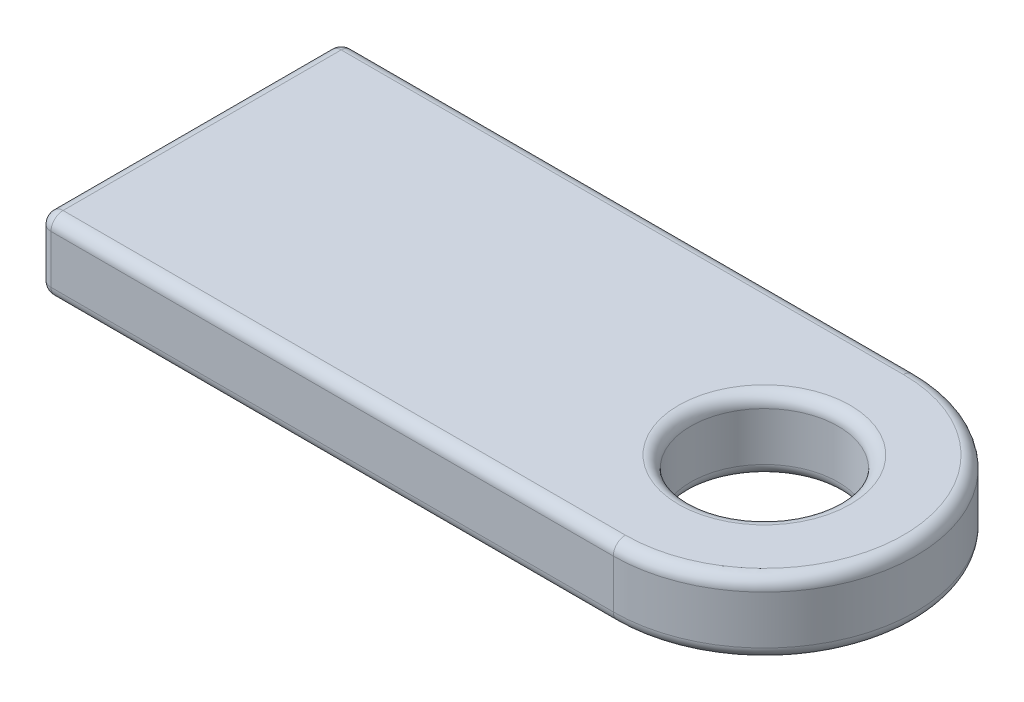
ISO-10303-21;
HEADER;
FILE_DESCRIPTION(('STEP AP214'),'2;1');
FILE_NAME('part.step','',(''),(''),'','','');
FILE_SCHEMA(('AUTOMOTIVE_DESIGN { 1 0 10303 214 1 1 1 1 }'));
ENDSEC;
DATA;
#1=APPLICATION_CONTEXT('core data for automotive mechanical design processes');
#2=APPLICATION_PROTOCOL_DEFINITION('international standard','automotive_design',2000,#1);
#3=PRODUCT_CONTEXT('',#1,'mechanical');
#4=PRODUCT('Part','Part','',(#3));
#5=PRODUCT_RELATED_PRODUCT_CATEGORY('part','',(#4));
#6=PRODUCT_DEFINITION_FORMATION('','',#4);
#7=PRODUCT_DEFINITION_CONTEXT('part definition',#1,'design');
#8=PRODUCT_DEFINITION('design','',#6,#7);
#9=PRODUCT_DEFINITION_SHAPE('','',#8);
#10=(LENGTH_UNIT() NAMED_UNIT(*) SI_UNIT(.MILLI.,.METRE.));
#11=(NAMED_UNIT(*) PLANE_ANGLE_UNIT() SI_UNIT($,.RADIAN.));
#12=(NAMED_UNIT(*) SI_UNIT($,.STERADIAN.) SOLID_ANGLE_UNIT());
#13=UNCERTAINTY_MEASURE_WITH_UNIT(LENGTH_MEASURE(1.E-05),#10,'distance_accuracy_value','');
#14=(GEOMETRIC_REPRESENTATION_CONTEXT(3) GLOBAL_UNCERTAINTY_ASSIGNED_CONTEXT((#13)) GLOBAL_UNIT_ASSIGNED_CONTEXT((#10,
#11,#12)) REPRESENTATION_CONTEXT('',''));
#15=CARTESIAN_POINT('',(0.,0.,0.));
#16=DIRECTION('',(0.,0.,1.));
#17=DIRECTION('',(1.,0.,0.));
#18=AXIS2_PLACEMENT_3D('',#15,#16,#17);
#19=CARTESIAN_POINT('',(23.75,3.,-6.25));
#20=DIRECTION('',(0.,1.,0.));
#21=DIRECTION('',(0.,0.,1.));
#22=AXIS2_PLACEMENT_3D('',#19,#20,#21);
#23=PLANE('',#22);
#24=CARTESIAN_POINT('',(23.75,3.,-6.25));
#25=DIRECTION('',(0.,1.,0.));
#26=DIRECTION('',(0.,0.,1.));
#27=AXIS2_PLACEMENT_3D('',#24,#25,#26);
#28=CIRCLE('',#27,3.55);
#29=CARTESIAN_POINT('',(23.75,3.,-2.7));
#30=VERTEX_POINT('',#29);
#31=EDGE_CURVE('E11',#30,#30,#28,.F.);
#32=ORIENTED_EDGE('',*,*,#31,.T.);
#33=EDGE_LOOP('',(#32));
#34=FACE_BOUND('',#33,.T.);
#35=CARTESIAN_POINT('',(23.75,3.,-6.25));
#36=DIRECTION('',(0.,1.,0.));
#37=DIRECTION('',(0.,0.,1.));
#38=AXIS2_PLACEMENT_3D('',#35,#36,#37);
#39=CIRCLE('',#38,5.75);
#40=CARTESIAN_POINT('',(23.75,3.,-0.500000000000002));
#41=VERTEX_POINT('',#40);
#42=CARTESIAN_POINT('',(23.75,3.,-12.));
#43=VERTEX_POINT('',#42);
#44=EDGE_CURVE('E57',#41,#43,#39,.T.);
#45=ORIENTED_EDGE('',*,*,#44,.T.);
#46=DIRECTION('',(-1.,0.,0.));
#47=VECTOR('',#46,1.);
#48=CARTESIAN_POINT('',(0.,3.,-12.));
#49=LINE('',#48,#47);
#50=CARTESIAN_POINT('',(0.5,3.,-12.));
#51=VERTEX_POINT('',#50);
#52=EDGE_CURVE('E49',#43,#51,#49,.T.);
#53=ORIENTED_EDGE('',*,*,#52,.T.);
#54=DIRECTION('',(0.,0.,1.));
#55=VECTOR('',#54,1.);
#56=CARTESIAN_POINT('',(0.5,3.,0.));
#57=LINE('',#56,#55);
#58=CARTESIAN_POINT('',(0.5,3.,-0.5));
#59=VERTEX_POINT('',#58);
#60=EDGE_CURVE('E212',#51,#59,#57,.T.);
#61=ORIENTED_EDGE('',*,*,#60,.T.);
#62=DIRECTION('',(1.,0.,0.));
#63=VECTOR('',#62,1.);
#64=CARTESIAN_POINT('',(23.75,3.,-0.500000000000002));
#65=LINE('',#64,#63);
#66=EDGE_CURVE('E62',#59,#41,#65,.T.);
#67=ORIENTED_EDGE('',*,*,#66,.T.);
#68=EDGE_LOOP('',(#45,#53,#61,#67));
#69=FACE_BOUND('',#68,.T.);
#70=ADVANCED_FACE('F39',(#34,#69),#23,.T.);
#71=CARTESIAN_POINT('',(23.75,0.,-6.25));
#72=DIRECTION('',(0.,1.,0.));
#73=DIRECTION('',(0.,0.,1.));
#74=AXIS2_PLACEMENT_3D('',#71,#72,#73);
#75=PLANE('',#74);
#76=CARTESIAN_POINT('',(23.75,0.,-6.25));
#77=DIRECTION('',(0.,1.,0.));
#78=DIRECTION('',(0.,0.,1.));
#79=AXIS2_PLACEMENT_3D('',#76,#77,#78);
#80=CIRCLE('',#79,3.55);
#81=CARTESIAN_POINT('',(23.75,0.,-2.7));
#82=VERTEX_POINT('',#81);
#83=EDGE_CURVE('E159',#82,#82,#80,.T.);
#84=ORIENTED_EDGE('',*,*,#83,.T.);
#85=EDGE_LOOP('',(#84));
#86=FACE_BOUND('',#85,.T.);
#87=CARTESIAN_POINT('',(23.75,0.,-6.25));
#88=DIRECTION('',(0.,1.,0.));
#89=DIRECTION('',(0.,0.,1.));
#90=AXIS2_PLACEMENT_3D('',#87,#88,#89);
#91=CIRCLE('',#90,5.75);
#92=CARTESIAN_POINT('',(23.75,0.,-12.));
#93=VERTEX_POINT('',#92);
#94=CARTESIAN_POINT('',(23.75,0.,-0.500000000000002));
#95=VERTEX_POINT('',#94);
#96=EDGE_CURVE('E157',#93,#95,#91,.F.);
#97=ORIENTED_EDGE('',*,*,#96,.T.);
#98=DIRECTION('',(1.,0.,0.));
#99=VECTOR('',#98,1.);
#100=CARTESIAN_POINT('',(23.75,0.,-0.500000000000002));
#101=LINE('',#100,#99);
#102=CARTESIAN_POINT('',(0.5,0.,-0.5));
#103=VERTEX_POINT('',#102);
#104=EDGE_CURVE('E123',#95,#103,#101,.F.);
#105=ORIENTED_EDGE('',*,*,#104,.T.);
#106=DIRECTION('',(0.,0.,1.));
#107=VECTOR('',#106,1.);
#108=CARTESIAN_POINT('',(0.5,0.,-6.25));
#109=LINE('',#108,#107);
#110=CARTESIAN_POINT('',(0.5,0.,-12.));
#111=VERTEX_POINT('',#110);
#112=EDGE_CURVE('E145',#103,#111,#109,.F.);
#113=ORIENTED_EDGE('',*,*,#112,.T.);
#114=DIRECTION('',(-1.,0.,0.));
#115=VECTOR('',#114,1.);
#116=CARTESIAN_POINT('',(23.75,0.,-12.));
#117=LINE('',#116,#115);
#118=EDGE_CURVE('E152',#111,#93,#117,.F.);
#119=ORIENTED_EDGE('',*,*,#118,.T.);
#120=EDGE_LOOP('',(#97,#105,#113,#119));
#121=FACE_BOUND('',#120,.T.);
#122=ADVANCED_FACE('F155',(#86,#121),#75,.F.);
#123=CARTESIAN_POINT('',(0.,3.,0.));
#124=DIRECTION('',(1.,0.,0.));
#125=DIRECTION('',(0.,0.,-1.));
#126=AXIS2_PLACEMENT_3D('',#123,#124,#125);
#127=PLANE('',#126);
#128=DIRECTION('',(0.,0.,1.));
#129=VECTOR('',#128,1.);
#130=CARTESIAN_POINT('',(0.,0.5,0.));
#131=LINE('',#130,#129);
#132=CARTESIAN_POINT('',(0.,0.5,-12.));
#133=VERTEX_POINT('',#132);
#134=CARTESIAN_POINT('',(0.,0.5,-0.5));
#135=VERTEX_POINT('',#134);
#136=EDGE_CURVE('E205',#133,#135,#131,.T.);
#137=ORIENTED_EDGE('',*,*,#136,.T.);
#138=DIRECTION('',(0.,-1.,0.));
#139=VECTOR('',#138,1.);
#140=CARTESIAN_POINT('',(0.,3.,-0.5));
#141=LINE('',#140,#139);
#142=CARTESIAN_POINT('',(0.,2.5,-0.5));
#143=VERTEX_POINT('',#142);
#144=EDGE_CURVE('E209',#135,#143,#141,.F.);
#145=ORIENTED_EDGE('',*,*,#144,.T.);
#146=DIRECTION('',(0.,0.,1.));
#147=VECTOR('',#146,1.);
#148=CARTESIAN_POINT('',(0.,2.5,-12.5));
#149=LINE('',#148,#147);
#150=CARTESIAN_POINT('',(0.,2.5,-12.));
#151=VERTEX_POINT('',#150);
#152=EDGE_CURVE('E202',#143,#151,#149,.F.);
#153=ORIENTED_EDGE('',*,*,#152,.T.);
#154=DIRECTION('',(0.,-1.,0.));
#155=VECTOR('',#154,1.);
#156=CARTESIAN_POINT('',(0.,3.,-12.));
#157=LINE('',#156,#155);
#158=EDGE_CURVE('E199',#151,#133,#157,.T.);
#159=ORIENTED_EDGE('',*,*,#158,.T.);
#160=EDGE_LOOP('',(#137,#145,#153,#159));
#161=FACE_BOUND('',#160,.T.);
#162=ADVANCED_FACE('F310',(#161),#127,.F.);
#163=CARTESIAN_POINT('',(0.,3.,0.));
#164=DIRECTION('',(0.,0.,-1.));
#165=DIRECTION('',(-1.,0.,0.));
#166=AXIS2_PLACEMENT_3D('',#163,#164,#165);
#167=PLANE('',#166);
#168=DIRECTION('',(0.,-1.,0.));
#169=VECTOR('',#168,1.);
#170=CARTESIAN_POINT('',(0.5,3.,0.));
#171=LINE('',#170,#169);
#172=CARTESIAN_POINT('',(0.5,2.5,0.));
#173=VERTEX_POINT('',#172);
#174=CARTESIAN_POINT('',(0.5,0.5,0.));
#175=VERTEX_POINT('',#174);
#176=EDGE_CURVE('E176',#173,#175,#171,.T.);
#177=ORIENTED_EDGE('',*,*,#176,.T.);
#178=DIRECTION('',(1.,0.,0.));
#179=VECTOR('',#178,1.);
#180=CARTESIAN_POINT('',(0.,0.5,0.));
#181=LINE('',#180,#179);
#182=CARTESIAN_POINT('',(23.75,0.5,0.));
#183=VERTEX_POINT('',#182);
#184=EDGE_CURVE('E126',#175,#183,#181,.T.);
#185=ORIENTED_EDGE('',*,*,#184,.T.);
#186=DIRECTION('',(0.,-1.,0.));
#187=VECTOR('',#186,1.);
#188=CARTESIAN_POINT('',(23.75,3.,0.));
#189=LINE('',#188,#187);
#190=CARTESIAN_POINT('',(23.75,2.5,0.));
#191=VERTEX_POINT('',#190);
#192=EDGE_CURVE('E153',#191,#183,#189,.T.);
#193=ORIENTED_EDGE('',*,*,#192,.F.);
#194=DIRECTION('',(1.,0.,0.));
#195=VECTOR('',#194,1.);
#196=CARTESIAN_POINT('',(0.,2.5,0.));
#197=LINE('',#196,#195);
#198=EDGE_CURVE('E179',#191,#173,#197,.F.);
#199=ORIENTED_EDGE('',*,*,#198,.T.);
#200=EDGE_LOOP('',(#177,#185,#193,#199));
#201=FACE_BOUND('',#200,.T.);
#202=ADVANCED_FACE('F293',(#201),#167,.F.);
#203=CARTESIAN_POINT('',(23.75,3.,-6.25));
#204=DIRECTION('',(0.,-1.,0.));
#205=DIRECTION('',(0.,0.,-1.));
#206=AXIS2_PLACEMENT_3D('',#203,#204,#205);
#207=CYLINDRICAL_SURFACE('',#206,6.25);
#208=ORIENTED_EDGE('',*,*,#192,.T.);
#209=CARTESIAN_POINT('',(23.75,0.5,-6.25));
#210=DIRECTION('',(0.,1.,0.));
#211=DIRECTION('',(0.,0.,1.));
#212=AXIS2_PLACEMENT_3D('',#209,#210,#211);
#213=CIRCLE('',#212,6.25);
#214=CARTESIAN_POINT('',(23.75,0.5,-12.5));
#215=VERTEX_POINT('',#214);
#216=EDGE_CURVE('E187',#183,#215,#213,.T.);
#217=ORIENTED_EDGE('',*,*,#216,.T.);
#218=DIRECTION('',(0.,-1.,0.));
#219=VECTOR('',#218,1.);
#220=CARTESIAN_POINT('',(23.75,3.,-12.5));
#221=LINE('',#220,#219);
#222=CARTESIAN_POINT('',(23.75,2.5,-12.5));
#223=VERTEX_POINT('',#222);
#224=EDGE_CURVE('E269',#223,#215,#221,.T.);
#225=ORIENTED_EDGE('',*,*,#224,.F.);
#226=CARTESIAN_POINT('',(23.75,2.5,-6.25));
#227=DIRECTION('',(0.,1.,0.));
#228=DIRECTION('',(0.,0.,1.));
#229=AXIS2_PLACEMENT_3D('',#226,#227,#228);
#230=CIRCLE('',#229,6.25);
#231=EDGE_CURVE('E184',#223,#191,#230,.F.);
#232=ORIENTED_EDGE('',*,*,#231,.T.);
#233=EDGE_LOOP('',(#208,#217,#225,#232));
#234=FACE_BOUND('',#233,.T.);
#235=ADVANCED_FACE('F296',(#234),#207,.T.);
#236=CARTESIAN_POINT('',(0.,3.,-12.5));
#237=DIRECTION('',(0.,0.,1.));
#238=DIRECTION('',(1.,0.,0.));
#239=AXIS2_PLACEMENT_3D('',#236,#237,#238);
#240=PLANE('',#239);
#241=ORIENTED_EDGE('',*,*,#224,.T.);
#242=DIRECTION('',(-1.,0.,0.));
#243=VECTOR('',#242,1.);
#244=CARTESIAN_POINT('',(0.,0.5,-12.5));
#245=LINE('',#244,#243);
#246=CARTESIAN_POINT('',(0.5,0.5,-12.5));
#247=VERTEX_POINT('',#246);
#248=EDGE_CURVE('E196',#215,#247,#245,.T.);
#249=ORIENTED_EDGE('',*,*,#248,.T.);
#250=DIRECTION('',(0.,-1.,0.));
#251=VECTOR('',#250,1.);
#252=CARTESIAN_POINT('',(0.5,3.,-12.5));
#253=LINE('',#252,#251);
#254=CARTESIAN_POINT('',(0.5,2.5,-12.5));
#255=VERTEX_POINT('',#254);
#256=EDGE_CURVE('E190',#247,#255,#253,.F.);
#257=ORIENTED_EDGE('',*,*,#256,.T.);
#258=DIRECTION('',(-1.,0.,0.));
#259=VECTOR('',#258,1.);
#260=CARTESIAN_POINT('',(23.75,2.5,-12.5));
#261=LINE('',#260,#259);
#262=EDGE_CURVE('E193',#255,#223,#261,.F.);
#263=ORIENTED_EDGE('',*,*,#262,.T.);
#264=EDGE_LOOP('',(#241,#249,#257,#263));
#265=FACE_BOUND('',#264,.T.);
#266=ADVANCED_FACE('F337',(#265),#240,.F.);
#267=CARTESIAN_POINT('',(23.75,3.,-6.25));
#268=DIRECTION('',(0.,-1.,0.));
#269=DIRECTION('',(0.,0.,-1.));
#270=AXIS2_PLACEMENT_3D('',#267,#268,#269);
#271=CYLINDRICAL_SURFACE('',#270,3.05);
#272=CARTESIAN_POINT('',(23.75,0.5,-6.25));
#273=DIRECTION('',(0.,1.,0.));
#274=DIRECTION('',(0.,0.,1.));
#275=AXIS2_PLACEMENT_3D('',#272,#273,#274);
#276=CIRCLE('',#275,3.05);
#277=CARTESIAN_POINT('',(23.75,0.5,-3.2));
#278=VERTEX_POINT('',#277);
#279=EDGE_CURVE('E172',#278,#278,#276,.F.);
#280=ORIENTED_EDGE('',*,*,#279,.T.);
#281=EDGE_LOOP('',(#280));
#282=FACE_BOUND('',#281,.T.);
#283=CARTESIAN_POINT('',(23.75,2.5,-6.25));
#284=DIRECTION('',(0.,1.,0.));
#285=DIRECTION('',(0.,0.,1.));
#286=AXIS2_PLACEMENT_3D('',#283,#284,#285);
#287=CIRCLE('',#286,3.05);
#288=CARTESIAN_POINT('',(23.75,2.5,-3.2));
#289=VERTEX_POINT('',#288);
#290=EDGE_CURVE('E164',#289,#289,#287,.T.);
#291=ORIENTED_EDGE('',*,*,#290,.T.);
#292=EDGE_LOOP('',(#291));
#293=FACE_BOUND('',#292,.T.);
#294=ADVANCED_FACE('F335',(#282,#293),#271,.F.);
#295=CARTESIAN_POINT('',(23.75,0.5,-6.25));
#296=DIRECTION('',(0.,1.,0.));
#297=DIRECTION('',(0.,0.,1.));
#298=AXIS2_PLACEMENT_3D('',#295,#296,#297);
#299=TOROIDAL_SURFACE('',#298,3.55,0.5);
#300=ORIENTED_EDGE('',*,*,#279,.F.);
#301=EDGE_LOOP('',(#300));
#302=FACE_BOUND('',#301,.T.);
#303=ORIENTED_EDGE('',*,*,#83,.F.);
#304=EDGE_LOOP('',(#303));
#305=FACE_BOUND('',#304,.T.);
#306=ADVANCED_FACE('F346',(#302,#305),#299,.T.);
#307=CARTESIAN_POINT('',(23.75,2.5,-12.));
#308=DIRECTION('',(1.,0.,0.));
#309=DIRECTION('',(0.,0.,-1.));
#310=AXIS2_PLACEMENT_3D('',#307,#308,#309);
#311=CYLINDRICAL_SURFACE('',#310,0.5);
#312=CARTESIAN_POINT('',(0.5,2.5,-12.));
#313=DIRECTION('',(-1.,0.,0.));
#314=DIRECTION('',(0.,0.,1.));
#315=AXIS2_PLACEMENT_3D('',#312,#313,#314);
#316=CIRCLE('',#315,0.5);
#317=EDGE_CURVE('E260',#51,#255,#316,.T.);
#318=ORIENTED_EDGE('',*,*,#317,.F.);
#319=ORIENTED_EDGE('',*,*,#52,.F.);
#320=CARTESIAN_POINT('',(23.75,2.5,-12.));
#321=DIRECTION('',(1.,0.,0.));
#322=DIRECTION('',(0.,0.,-1.));
#323=AXIS2_PLACEMENT_3D('',#320,#321,#322);
#324=CIRCLE('',#323,0.5);
#325=EDGE_CURVE('E43',#223,#43,#324,.T.);
#326=ORIENTED_EDGE('',*,*,#325,.F.);
#327=ORIENTED_EDGE('',*,*,#262,.F.);
#328=EDGE_LOOP('',(#318,#319,#326,#327));
#329=FACE_BOUND('',#328,.T.);
#330=ADVANCED_FACE('F349',(#329),#311,.T.);
#331=CARTESIAN_POINT('',(23.75,2.5,-6.25));
#332=DIRECTION('',(0.,1.,0.));
#333=DIRECTION('',(0.,0.,1.));
#334=AXIS2_PLACEMENT_3D('',#331,#332,#333);
#335=TOROIDAL_SURFACE('',#334,5.75,0.5);
#336=ORIENTED_EDGE('',*,*,#325,.T.);
#337=ORIENTED_EDGE('',*,*,#44,.F.);
#338=CARTESIAN_POINT('',(23.75,2.5,-0.500000000000002));
#339=DIRECTION('',(-1.,0.,0.));
#340=DIRECTION('',(0.,0.,1.));
#341=AXIS2_PLACEMENT_3D('',#338,#339,#340);
#342=CIRCLE('',#341,0.5);
#343=EDGE_CURVE('E253',#191,#41,#342,.T.);
#344=ORIENTED_EDGE('',*,*,#343,.F.);
#345=ORIENTED_EDGE('',*,*,#231,.F.);
#346=EDGE_LOOP('',(#336,#337,#344,#345));
#347=FACE_BOUND('',#346,.T.);
#348=ADVANCED_FACE('F297',(#347),#335,.T.);
#349=CARTESIAN_POINT('',(0.5,2.5,-12.));
#350=DIRECTION('',(0.,1.,0.));
#351=DIRECTION('',(-1.,0.,0.));
#352=AXIS2_PLACEMENT_3D('',#349,#350,#351);
#353=SPHERICAL_SURFACE('',#352,0.5);
#354=CARTESIAN_POINT('',(0.5,2.5,-12.));
#355=DIRECTION('',(0.,1.,0.));
#356=DIRECTION('',(0.,0.,1.));
#357=AXIS2_PLACEMENT_3D('',#354,#355,#356);
#358=CIRCLE('',#357,0.5);
#359=EDGE_CURVE('E249',#151,#255,#358,.F.);
#360=ORIENTED_EDGE('',*,*,#359,.F.);
#361=CARTESIAN_POINT('',(0.5,2.5,-12.));
#362=DIRECTION('',(0.,0.,-1.));
#363=DIRECTION('',(-1.,0.,0.));
#364=AXIS2_PLACEMENT_3D('',#361,#362,#363);
#365=CIRCLE('',#364,0.5);
#366=EDGE_CURVE('E257',#51,#151,#365,.F.);
#367=ORIENTED_EDGE('',*,*,#366,.F.);
#368=ORIENTED_EDGE('',*,*,#317,.T.);
#369=EDGE_LOOP('',(#360,#367,#368));
#370=FACE_BOUND('',#369,.T.);
#371=ADVANCED_FACE('F434',(#370),#353,.T.);
#372=CARTESIAN_POINT('',(0.5,2.5,-6.25));
#373=DIRECTION('',(0.,0.,-1.));
#374=DIRECTION('',(-1.,0.,0.));
#375=AXIS2_PLACEMENT_3D('',#372,#373,#374);
#376=CYLINDRICAL_SURFACE('',#375,0.5);
#377=ORIENTED_EDGE('',*,*,#366,.T.);
#378=ORIENTED_EDGE('',*,*,#152,.F.);
#379=CARTESIAN_POINT('',(0.5,2.5,-0.5));
#380=DIRECTION('',(0.,0.,1.));
#381=DIRECTION('',(1.,0.,0.));
#382=AXIS2_PLACEMENT_3D('',#379,#380,#381);
#383=CIRCLE('',#382,0.5);
#384=EDGE_CURVE('E245',#59,#143,#383,.T.);
#385=ORIENTED_EDGE('',*,*,#384,.F.);
#386=ORIENTED_EDGE('',*,*,#60,.F.);
#387=EDGE_LOOP('',(#377,#378,#385,#386));
#388=FACE_BOUND('',#387,.T.);
#389=ADVANCED_FACE('F426',(#388),#376,.T.);
#390=CARTESIAN_POINT('',(23.75,2.5,-0.500000000000002));
#391=DIRECTION('',(-1.,0.,0.));
#392=DIRECTION('',(0.,0.,1.));
#393=AXIS2_PLACEMENT_3D('',#390,#391,#392);
#394=CYLINDRICAL_SURFACE('',#393,0.5);
#395=ORIENTED_EDGE('',*,*,#343,.T.);
#396=ORIENTED_EDGE('',*,*,#66,.F.);
#397=CARTESIAN_POINT('',(0.5,2.5,-0.5));
#398=DIRECTION('',(-1.,0.,0.));
#399=DIRECTION('',(0.,-1.,0.));
#400=AXIS2_PLACEMENT_3D('',#397,#398,#399);
#401=CIRCLE('',#400,0.5);
#402=EDGE_CURVE('E241',#173,#59,#401,.T.);
#403=ORIENTED_EDGE('',*,*,#402,.F.);
#404=ORIENTED_EDGE('',*,*,#198,.F.);
#405=EDGE_LOOP('',(#395,#396,#403,#404));
#406=FACE_BOUND('',#405,.T.);
#407=ADVANCED_FACE('F301',(#406),#394,.T.);
#408=CARTESIAN_POINT('',(0.5,3.,-12.));
#409=DIRECTION('',(0.,-1.,0.));
#410=DIRECTION('',(0.,0.,-1.));
#411=AXIS2_PLACEMENT_3D('',#408,#409,#410);
#412=CYLINDRICAL_SURFACE('',#411,0.5);
#413=ORIENTED_EDGE('',*,*,#359,.T.);
#414=ORIENTED_EDGE('',*,*,#256,.F.);
#415=CARTESIAN_POINT('',(0.5,0.5,-12.));
#416=DIRECTION('',(0.,-1.,0.));
#417=DIRECTION('',(0.,0.,-1.));
#418=AXIS2_PLACEMENT_3D('',#415,#416,#417);
#419=CIRCLE('',#418,0.5);
#420=EDGE_CURVE('E237',#133,#247,#419,.T.);
#421=ORIENTED_EDGE('',*,*,#420,.F.);
#422=ORIENTED_EDGE('',*,*,#158,.F.);
#423=EDGE_LOOP('',(#413,#414,#421,#422));
#424=FACE_BOUND('',#423,.T.);
#425=ADVANCED_FACE('F315',(#424),#412,.T.);
#426=CARTESIAN_POINT('',(0.5,2.5,-0.5));
#427=DIRECTION('',(0.,1.,0.));
#428=DIRECTION('',(0.,0.,1.));
#429=AXIS2_PLACEMENT_3D('',#426,#427,#428);
#430=SPHERICAL_SURFACE('',#429,0.5);
#431=ORIENTED_EDGE('',*,*,#402,.T.);
#432=ORIENTED_EDGE('',*,*,#384,.T.);
#433=CARTESIAN_POINT('',(0.5,2.5,-0.5));
#434=DIRECTION('',(0.,1.,0.));
#435=DIRECTION('',(0.,0.,1.));
#436=AXIS2_PLACEMENT_3D('',#433,#434,#435);
#437=CIRCLE('',#436,0.5);
#438=EDGE_CURVE('E231',#173,#143,#437,.F.);
#439=ORIENTED_EDGE('',*,*,#438,.F.);
#440=EDGE_LOOP('',(#431,#432,#439));
#441=FACE_BOUND('',#440,.T.);
#442=ADVANCED_FACE('F305',(#441),#430,.T.);
#443=CARTESIAN_POINT('',(0.5,0.5,-12.));
#444=DIRECTION('',(-1.,0.,0.));
#445=DIRECTION('',(0.,0.,1.));
#446=AXIS2_PLACEMENT_3D('',#443,#444,#445);
#447=SPHERICAL_SURFACE('',#446,0.5);
#448=CARTESIAN_POINT('',(0.5,0.5,-12.));
#449=DIRECTION('',(-1.,0.,0.));
#450=DIRECTION('',(0.,0.,1.));
#451=AXIS2_PLACEMENT_3D('',#448,#449,#450);
#452=CIRCLE('',#451,0.5);
#453=EDGE_CURVE('E142',#111,#247,#452,.F.);
#454=ORIENTED_EDGE('',*,*,#453,.F.);
#455=CARTESIAN_POINT('',(0.5,0.5,-12.));
#456=DIRECTION('',(0.,0.,-1.));
#457=DIRECTION('',(-1.,0.,0.));
#458=AXIS2_PLACEMENT_3D('',#455,#456,#457);
#459=CIRCLE('',#458,0.5);
#460=EDGE_CURVE('E148',#133,#111,#459,.F.);
#461=ORIENTED_EDGE('',*,*,#460,.F.);
#462=ORIENTED_EDGE('',*,*,#420,.T.);
#463=EDGE_LOOP('',(#454,#461,#462));
#464=FACE_BOUND('',#463,.T.);
#465=ADVANCED_FACE('F317',(#464),#447,.T.);
#466=CARTESIAN_POINT('',(0.5,0.5,0.));
#467=DIRECTION('',(0.,0.,1.));
#468=DIRECTION('',(1.,0.,0.));
#469=AXIS2_PLACEMENT_3D('',#466,#467,#468);
#470=CYLINDRICAL_SURFACE('',#469,0.5);
#471=ORIENTED_EDGE('',*,*,#460,.T.);
#472=ORIENTED_EDGE('',*,*,#112,.F.);
#473=CARTESIAN_POINT('',(0.5,0.5,-0.5));
#474=DIRECTION('',(0.,0.,1.));
#475=DIRECTION('',(1.,0.,0.));
#476=AXIS2_PLACEMENT_3D('',#473,#474,#475);
#477=CIRCLE('',#476,0.5);
#478=EDGE_CURVE('E133',#135,#103,#477,.T.);
#479=ORIENTED_EDGE('',*,*,#478,.F.);
#480=ORIENTED_EDGE('',*,*,#136,.F.);
#481=EDGE_LOOP('',(#471,#472,#479,#480));
#482=FACE_BOUND('',#481,.T.);
#483=ADVANCED_FACE('F146',(#482),#470,.T.);
#484=CARTESIAN_POINT('',(0.5,3.,-0.5));
#485=DIRECTION('',(0.,-1.,0.));
#486=DIRECTION('',(0.,0.,-1.));
#487=AXIS2_PLACEMENT_3D('',#484,#485,#486);
#488=CYLINDRICAL_SURFACE('',#487,0.5);
#489=ORIENTED_EDGE('',*,*,#438,.T.);
#490=ORIENTED_EDGE('',*,*,#144,.F.);
#491=CARTESIAN_POINT('',(0.5,0.5,-0.5));
#492=DIRECTION('',(0.,-1.,0.));
#493=DIRECTION('',(0.,0.,-1.));
#494=AXIS2_PLACEMENT_3D('',#491,#492,#493);
#495=CIRCLE('',#494,0.5);
#496=EDGE_CURVE('E137',#175,#135,#495,.T.);
#497=ORIENTED_EDGE('',*,*,#496,.F.);
#498=ORIENTED_EDGE('',*,*,#176,.F.);
#499=EDGE_LOOP('',(#489,#490,#497,#498));
#500=FACE_BOUND('',#499,.T.);
#501=ADVANCED_FACE('F307',(#500),#488,.T.);
#502=CARTESIAN_POINT('',(0.,0.5,-12.));
#503=DIRECTION('',(-1.,0.,0.));
#504=DIRECTION('',(0.,0.,1.));
#505=AXIS2_PLACEMENT_3D('',#502,#503,#504);
#506=CYLINDRICAL_SURFACE('',#505,0.5);
#507=ORIENTED_EDGE('',*,*,#453,.T.);
#508=ORIENTED_EDGE('',*,*,#248,.F.);
#509=CARTESIAN_POINT('',(23.75,0.5,-12.));
#510=DIRECTION('',(1.,0.,0.));
#511=DIRECTION('',(0.,0.,-1.));
#512=AXIS2_PLACEMENT_3D('',#509,#510,#511);
#513=CIRCLE('',#512,0.5);
#514=EDGE_CURVE('E129',#93,#215,#513,.T.);
#515=ORIENTED_EDGE('',*,*,#514,.F.);
#516=ORIENTED_EDGE('',*,*,#118,.F.);
#517=EDGE_LOOP('',(#507,#508,#515,#516));
#518=FACE_BOUND('',#517,.T.);
#519=ADVANCED_FACE('F286',(#518),#506,.T.);
#520=CARTESIAN_POINT('',(0.5,0.5,-0.5));
#521=DIRECTION('',(-1.,0.,0.));
#522=DIRECTION('',(0.,0.,1.));
#523=AXIS2_PLACEMENT_3D('',#520,#521,#522);
#524=SPHERICAL_SURFACE('',#523,0.5);
#525=ORIENTED_EDGE('',*,*,#496,.T.);
#526=ORIENTED_EDGE('',*,*,#478,.T.);
#527=CARTESIAN_POINT('',(0.5,0.5,-0.5));
#528=DIRECTION('',(-1.,0.,0.));
#529=DIRECTION('',(0.,0.,1.));
#530=AXIS2_PLACEMENT_3D('',#527,#528,#529);
#531=CIRCLE('',#530,0.5);
#532=EDGE_CURVE('E119',#175,#103,#531,.F.);
#533=ORIENTED_EDGE('',*,*,#532,.F.);
#534=EDGE_LOOP('',(#525,#526,#533));
#535=FACE_BOUND('',#534,.T.);
#536=ADVANCED_FACE('F135',(#535),#524,.T.);
#537=CARTESIAN_POINT('',(23.75,0.5,-6.25));
#538=DIRECTION('',(0.,1.,0.));
#539=DIRECTION('',(0.,0.,1.));
#540=AXIS2_PLACEMENT_3D('',#537,#538,#539);
#541=TOROIDAL_SURFACE('',#540,5.75,0.5);
#542=ORIENTED_EDGE('',*,*,#514,.T.);
#543=ORIENTED_EDGE('',*,*,#216,.F.);
#544=CARTESIAN_POINT('',(23.75,0.5,-0.500000000000002));
#545=DIRECTION('',(-1.,0.,0.));
#546=DIRECTION('',(0.,0.,1.));
#547=AXIS2_PLACEMENT_3D('',#544,#545,#546);
#548=CIRCLE('',#547,0.5);
#549=EDGE_CURVE('E130',#95,#183,#548,.T.);
#550=ORIENTED_EDGE('',*,*,#549,.F.);
#551=ORIENTED_EDGE('',*,*,#96,.F.);
#552=EDGE_LOOP('',(#542,#543,#550,#551));
#553=FACE_BOUND('',#552,.T.);
#554=ADVANCED_FACE('F289',(#553),#541,.T.);
#555=CARTESIAN_POINT('',(0.,0.5,-0.5));
#556=DIRECTION('',(1.,0.,0.));
#557=DIRECTION('',(0.,0.,-1.));
#558=AXIS2_PLACEMENT_3D('',#555,#556,#557);
#559=CYLINDRICAL_SURFACE('',#558,0.5);
#560=ORIENTED_EDGE('',*,*,#532,.T.);
#561=ORIENTED_EDGE('',*,*,#104,.F.);
#562=ORIENTED_EDGE('',*,*,#549,.T.);
#563=ORIENTED_EDGE('',*,*,#184,.F.);
#564=EDGE_LOOP('',(#560,#561,#562,#563));
#565=FACE_BOUND('',#564,.T.);
#566=ADVANCED_FACE('F121',(#565),#559,.T.);
#567=CARTESIAN_POINT('',(23.75,2.5,-6.25));
#568=DIRECTION('',(0.,1.,0.));
#569=DIRECTION('',(0.,0.,1.));
#570=AXIS2_PLACEMENT_3D('',#567,#568,#569);
#571=TOROIDAL_SURFACE('',#570,3.55,0.5);
#572=ORIENTED_EDGE('',*,*,#31,.F.);
#573=EDGE_LOOP('',(#572));
#574=FACE_BOUND('',#573,.T.);
#575=ORIENTED_EDGE('',*,*,#290,.F.);
#576=EDGE_LOOP('',(#575));
#577=FACE_BOUND('',#576,.T.);
#578=ADVANCED_FACE('F41',(#574,#577),#571,.T.);
#579=CLOSED_SHELL('',(#70,#122,#162,#202,#235,#266,#294,#306,#330,#348,#371,#389,#407,#425,#442,
#465,#483,#501,#519,#536,#554,#566,#578));
#580=MANIFOLD_SOLID_BREP('B2',#579);
#581=ADVANCED_BREP_SHAPE_REPRESENTATION('',(#18,#580),#14);
#582=SHAPE_DEFINITION_REPRESENTATION(#9,#581);
ENDSEC;
END-ISO-10303-21;
